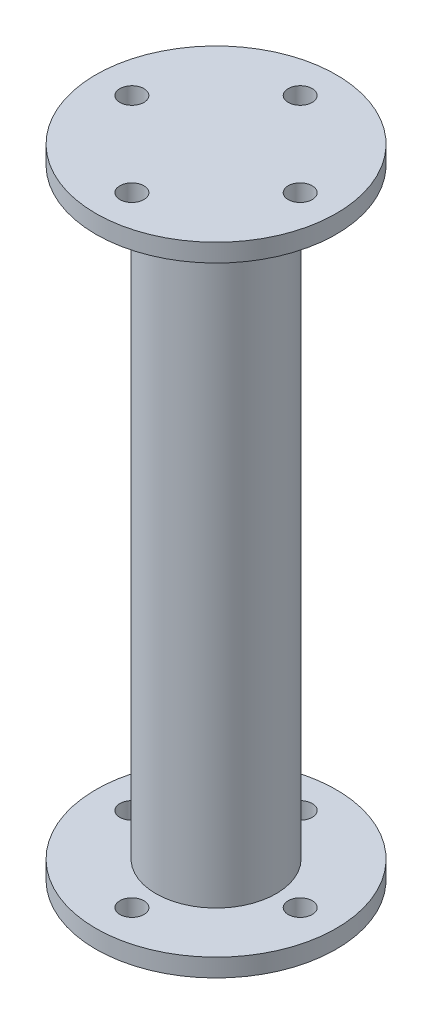
ISO-10303-21;
HEADER;
FILE_DESCRIPTION(('STEP AP214'),'2;1');
FILE_NAME('part.step','',(''),(''),'','','');
FILE_SCHEMA(('AUTOMOTIVE_DESIGN { 1 0 10303 214 1 1 1 1 }'));
ENDSEC;
DATA;
#1=APPLICATION_CONTEXT('core data for automotive mechanical design processes');
#2=APPLICATION_PROTOCOL_DEFINITION('international standard','automotive_design',2000,#1);
#3=PRODUCT_CONTEXT('',#1,'mechanical');
#4=PRODUCT('Part','Part','',(#3));
#5=PRODUCT_RELATED_PRODUCT_CATEGORY('part','',(#4));
#6=PRODUCT_DEFINITION_FORMATION('','',#4);
#7=PRODUCT_DEFINITION_CONTEXT('part definition',#1,'design');
#8=PRODUCT_DEFINITION('design','',#6,#7);
#9=PRODUCT_DEFINITION_SHAPE('','',#8);
#10=(LENGTH_UNIT() NAMED_UNIT(*) SI_UNIT(.MILLI.,.METRE.));
#11=(NAMED_UNIT(*) PLANE_ANGLE_UNIT() SI_UNIT($,.RADIAN.));
#12=(NAMED_UNIT(*) SI_UNIT($,.STERADIAN.) SOLID_ANGLE_UNIT());
#13=UNCERTAINTY_MEASURE_WITH_UNIT(LENGTH_MEASURE(1.E-05),#10,'distance_accuracy_value','');
#14=(GEOMETRIC_REPRESENTATION_CONTEXT(3) GLOBAL_UNCERTAINTY_ASSIGNED_CONTEXT((#13)) GLOBAL_UNIT_ASSIGNED_CONTEXT((#10,
#11,#12)) REPRESENTATION_CONTEXT('',''));
#15=CARTESIAN_POINT('',(0.,0.,0.));
#16=DIRECTION('',(0.,0.,1.));
#17=DIRECTION('',(1.,0.,0.));
#18=AXIS2_PLACEMENT_3D('',#15,#16,#17);
#19=CARTESIAN_POINT('',(-7.,1.5,0.));
#20=DIRECTION('',(0.,-1.,0.));
#21=DIRECTION('',(0.,0.,-1.));
#22=AXIS2_PLACEMENT_3D('',#19,#20,#21);
#23=CYLINDRICAL_SURFACE('',#22,1.);
#24=CARTESIAN_POINT('',(-7.,1.5,0.));
#25=DIRECTION('',(0.,1.,0.));
#26=DIRECTION('',(0.,0.,1.));
#27=AXIS2_PLACEMENT_3D('',#24,#25,#26);
#28=CIRCLE('',#27,1.);
#29=CARTESIAN_POINT('',(-7.,1.5,1.));
#30=VERTEX_POINT('',#29);
#31=EDGE_CURVE('E54',#30,#30,#28,.T.);
#32=ORIENTED_EDGE('',*,*,#31,.T.);
#33=EDGE_LOOP('',(#32));
#34=FACE_BOUND('',#33,.T.);
#35=CARTESIAN_POINT('',(-7.,0.,0.));
#36=DIRECTION('',(0.,1.,0.));
#37=DIRECTION('',(0.,0.,1.));
#38=AXIS2_PLACEMENT_3D('',#35,#36,#37);
#39=CIRCLE('',#38,1.);
#40=CARTESIAN_POINT('',(-7.,0.,1.));
#41=VERTEX_POINT('',#40);
#42=EDGE_CURVE('E86',#41,#41,#39,.T.);
#43=ORIENTED_EDGE('',*,*,#42,.F.);
#44=EDGE_LOOP('',(#43));
#45=FACE_BOUND('',#44,.T.);
#46=ADVANCED_FACE('F39',(#34,#45),#23,.F.);
#47=CARTESIAN_POINT('',(0.,1.5,-7.));
#48=DIRECTION('',(0.,-1.,0.));
#49=DIRECTION('',(0.,0.,-1.));
#50=AXIS2_PLACEMENT_3D('',#47,#48,#49);
#51=CYLINDRICAL_SURFACE('',#50,1.);
#52=CARTESIAN_POINT('',(0.,1.5,-7.));
#53=DIRECTION('',(0.,1.,0.));
#54=DIRECTION('',(0.,0.,1.));
#55=AXIS2_PLACEMENT_3D('',#52,#53,#54);
#56=CIRCLE('',#55,1.);
#57=CARTESIAN_POINT('',(0.,1.5,-6.));
#58=VERTEX_POINT('',#57);
#59=EDGE_CURVE('E68',#58,#58,#56,.T.);
#60=ORIENTED_EDGE('',*,*,#59,.T.);
#61=EDGE_LOOP('',(#60));
#62=FACE_BOUND('',#61,.T.);
#63=CARTESIAN_POINT('',(0.,0.,-7.));
#64=DIRECTION('',(0.,1.,0.));
#65=DIRECTION('',(0.,0.,1.));
#66=AXIS2_PLACEMENT_3D('',#63,#64,#65);
#67=CIRCLE('',#66,1.);
#68=CARTESIAN_POINT('',(0.,0.,-6.));
#69=VERTEX_POINT('',#68);
#70=EDGE_CURVE('E83',#69,#69,#67,.T.);
#71=ORIENTED_EDGE('',*,*,#70,.F.);
#72=EDGE_LOOP('',(#71));
#73=FACE_BOUND('',#72,.T.);
#74=ADVANCED_FACE('F115',(#62,#73),#51,.F.);
#75=CARTESIAN_POINT('',(7.,1.5,0.));
#76=DIRECTION('',(0.,-1.,0.));
#77=DIRECTION('',(0.,0.,-1.));
#78=AXIS2_PLACEMENT_3D('',#75,#76,#77);
#79=CYLINDRICAL_SURFACE('',#78,1.);
#80=CARTESIAN_POINT('',(7.,1.5,0.));
#81=DIRECTION('',(0.,1.,0.));
#82=DIRECTION('',(0.,0.,1.));
#83=AXIS2_PLACEMENT_3D('',#80,#81,#82);
#84=CIRCLE('',#83,1.);
#85=CARTESIAN_POINT('',(7.,1.5,1.));
#86=VERTEX_POINT('',#85);
#87=EDGE_CURVE('E64',#86,#86,#84,.T.);
#88=ORIENTED_EDGE('',*,*,#87,.T.);
#89=EDGE_LOOP('',(#88));
#90=FACE_BOUND('',#89,.T.);
#91=CARTESIAN_POINT('',(7.,0.,0.));
#92=DIRECTION('',(0.,1.,0.));
#93=DIRECTION('',(0.,0.,1.));
#94=AXIS2_PLACEMENT_3D('',#91,#92,#93);
#95=CIRCLE('',#94,1.);
#96=CARTESIAN_POINT('',(7.,0.,1.));
#97=VERTEX_POINT('',#96);
#98=EDGE_CURVE('E79',#97,#97,#95,.T.);
#99=ORIENTED_EDGE('',*,*,#98,.F.);
#100=EDGE_LOOP('',(#99));
#101=FACE_BOUND('',#100,.T.);
#102=ADVANCED_FACE('F121',(#90,#101),#79,.F.);
#103=CARTESIAN_POINT('',(0.,1.5,7.));
#104=DIRECTION('',(0.,-1.,0.));
#105=DIRECTION('',(0.,0.,-1.));
#106=AXIS2_PLACEMENT_3D('',#103,#104,#105);
#107=CYLINDRICAL_SURFACE('',#106,1.);
#108=CARTESIAN_POINT('',(0.,1.5,7.));
#109=DIRECTION('',(0.,1.,0.));
#110=DIRECTION('',(0.,0.,1.));
#111=AXIS2_PLACEMENT_3D('',#108,#109,#110);
#112=CIRCLE('',#111,1.);
#113=CARTESIAN_POINT('',(0.,1.5,8.));
#114=VERTEX_POINT('',#113);
#115=EDGE_CURVE('E60',#114,#114,#112,.T.);
#116=ORIENTED_EDGE('',*,*,#115,.T.);
#117=EDGE_LOOP('',(#116));
#118=FACE_BOUND('',#117,.T.);
#119=CARTESIAN_POINT('',(0.,0.,7.));
#120=DIRECTION('',(0.,1.,0.));
#121=DIRECTION('',(0.,0.,1.));
#122=AXIS2_PLACEMENT_3D('',#119,#120,#121);
#123=CIRCLE('',#122,1.);
#124=CARTESIAN_POINT('',(0.,0.,8.));
#125=VERTEX_POINT('',#124);
#126=EDGE_CURVE('E75',#125,#125,#123,.T.);
#127=ORIENTED_EDGE('',*,*,#126,.F.);
#128=EDGE_LOOP('',(#127));
#129=FACE_BOUND('',#128,.T.);
#130=ADVANCED_FACE('F41',(#118,#129),#107,.F.);
#131=CARTESIAN_POINT('',(0.,1.5,0.));
#132=DIRECTION('',(0.,-1.,0.));
#133=DIRECTION('',(0.,0.,-1.));
#134=AXIS2_PLACEMENT_3D('',#131,#132,#133);
#135=CYLINDRICAL_SURFACE('',#134,10.);
#136=CARTESIAN_POINT('',(0.,1.5,0.));
#137=DIRECTION('',(0.,1.,0.));
#138=DIRECTION('',(0.,0.,1.));
#139=AXIS2_PLACEMENT_3D('',#136,#137,#138);
#140=CIRCLE('',#139,10.);
#141=CARTESIAN_POINT('',(0.,1.5,10.));
#142=VERTEX_POINT('',#141);
#143=EDGE_CURVE('E48',#142,#142,#140,.T.);
#144=ORIENTED_EDGE('',*,*,#143,.F.);
#145=EDGE_LOOP('',(#144));
#146=FACE_BOUND('',#145,.T.);
#147=CARTESIAN_POINT('',(0.,0.,0.));
#148=DIRECTION('',(0.,1.,0.));
#149=DIRECTION('',(0.,0.,1.));
#150=AXIS2_PLACEMENT_3D('',#147,#148,#149);
#151=CIRCLE('',#150,10.);
#152=CARTESIAN_POINT('',(0.,0.,10.));
#153=VERTEX_POINT('',#152);
#154=EDGE_CURVE('E43',#153,#153,#151,.T.);
#155=ORIENTED_EDGE('',*,*,#154,.T.);
#156=EDGE_LOOP('',(#155));
#157=FACE_BOUND('',#156,.T.);
#158=ADVANCED_FACE('F95',(#146,#157),#135,.T.);
#159=CARTESIAN_POINT('',(0.,1.5,0.));
#160=DIRECTION('',(0.,1.,0.));
#161=DIRECTION('',(0.,0.,1.));
#162=AXIS2_PLACEMENT_3D('',#159,#160,#161);
#163=PLANE('',#162);
#164=CARTESIAN_POINT('',(0.,1.5,0.));
#165=DIRECTION('',(0.,1.,0.));
#166=DIRECTION('',(0.,0.,1.));
#167=AXIS2_PLACEMENT_3D('',#164,#165,#166);
#168=CIRCLE('',#167,5.);
#169=CARTESIAN_POINT('',(0.,1.5,5.));
#170=VERTEX_POINT('',#169);
#171=EDGE_CURVE('E10',#170,#170,#168,.T.);
#172=ORIENTED_EDGE('',*,*,#171,.F.);
#173=EDGE_LOOP('',(#172));
#174=FACE_BOUND('',#173,.T.);
#175=ORIENTED_EDGE('',*,*,#115,.F.);
#176=EDGE_LOOP('',(#175));
#177=FACE_BOUND('',#176,.T.);
#178=ORIENTED_EDGE('',*,*,#87,.F.);
#179=EDGE_LOOP('',(#178));
#180=FACE_BOUND('',#179,.T.);
#181=ORIENTED_EDGE('',*,*,#59,.F.);
#182=EDGE_LOOP('',(#181));
#183=FACE_BOUND('',#182,.T.);
#184=ORIENTED_EDGE('',*,*,#31,.F.);
#185=EDGE_LOOP('',(#184));
#186=FACE_BOUND('',#185,.T.);
#187=ORIENTED_EDGE('',*,*,#143,.T.);
#188=EDGE_LOOP('',(#187));
#189=FACE_BOUND('',#188,.T.);
#190=ADVANCED_FACE('F100',(#174,#177,#180,#183,#186,#189),#163,.T.);
#191=CARTESIAN_POINT('',(0.,0.,0.));
#192=DIRECTION('',(0.,1.,0.));
#193=DIRECTION('',(0.,0.,1.));
#194=AXIS2_PLACEMENT_3D('',#191,#192,#193);
#195=PLANE('',#194);
#196=ORIENTED_EDGE('',*,*,#126,.T.);
#197=EDGE_LOOP('',(#196));
#198=FACE_BOUND('',#197,.T.);
#199=ORIENTED_EDGE('',*,*,#98,.T.);
#200=EDGE_LOOP('',(#199));
#201=FACE_BOUND('',#200,.T.);
#202=ORIENTED_EDGE('',*,*,#70,.T.);
#203=EDGE_LOOP('',(#202));
#204=FACE_BOUND('',#203,.T.);
#205=ORIENTED_EDGE('',*,*,#42,.T.);
#206=EDGE_LOOP('',(#205));
#207=FACE_BOUND('',#206,.T.);
#208=ORIENTED_EDGE('',*,*,#154,.F.);
#209=EDGE_LOOP('',(#208));
#210=FACE_BOUND('',#209,.T.);
#211=ADVANCED_FACE('F97',(#198,#201,#204,#207,#210),#195,.F.);
#212=CARTESIAN_POINT('',(0.,51.5,0.));
#213=DIRECTION('',(0.,-1.,0.));
#214=DIRECTION('',(0.,0.,-1.));
#215=AXIS2_PLACEMENT_3D('',#212,#213,#214);
#216=CYLINDRICAL_SURFACE('',#215,5.);
#217=CARTESIAN_POINT('',(0.,51.5,0.));
#218=DIRECTION('',(0.,1.,0.));
#219=DIRECTION('',(0.,0.,1.));
#220=AXIS2_PLACEMENT_3D('',#217,#218,#219);
#221=CIRCLE('',#220,5.);
#222=CARTESIAN_POINT('',(0.,51.5,5.));
#223=VERTEX_POINT('',#222);
#224=EDGE_CURVE('E58',#223,#223,#221,.T.);
#225=ORIENTED_EDGE('',*,*,#224,.F.);
#226=EDGE_LOOP('',(#225));
#227=FACE_BOUND('',#226,.T.);
#228=ORIENTED_EDGE('',*,*,#171,.T.);
#229=EDGE_LOOP('',(#228));
#230=FACE_BOUND('',#229,.T.);
#231=ADVANCED_FACE('F99',(#227,#230),#216,.T.);
#232=CARTESIAN_POINT('',(-7.,51.5,0.));
#233=DIRECTION('',(0.,1.,0.));
#234=DIRECTION('',(0.,0.,1.));
#235=AXIS2_PLACEMENT_3D('',#232,#233,#234);
#236=CYLINDRICAL_SURFACE('',#235,1.);
#237=CARTESIAN_POINT('',(-7.,51.5,0.));
#238=DIRECTION('',(0.,1.,0.));
#239=DIRECTION('',(0.,0.,1.));
#240=AXIS2_PLACEMENT_3D('',#237,#238,#239);
#241=CIRCLE('',#240,1.);
#242=CARTESIAN_POINT('',(-7.,51.5,1.));
#243=VERTEX_POINT('',#242);
#244=EDGE_CURVE('E274',#243,#243,#241,.T.);
#245=ORIENTED_EDGE('',*,*,#244,.F.);
#246=EDGE_LOOP('',(#245));
#247=FACE_BOUND('',#246,.T.);
#248=CARTESIAN_POINT('',(-7.,53.,0.));
#249=DIRECTION('',(0.,1.,0.));
#250=DIRECTION('',(0.,0.,1.));
#251=AXIS2_PLACEMENT_3D('',#248,#249,#250);
#252=CIRCLE('',#251,1.);
#253=CARTESIAN_POINT('',(-7.,53.,1.));
#254=VERTEX_POINT('',#253);
#255=EDGE_CURVE('E250',#254,#254,#252,.T.);
#256=ORIENTED_EDGE('',*,*,#255,.T.);
#257=EDGE_LOOP('',(#256));
#258=FACE_BOUND('',#257,.T.);
#259=ADVANCED_FACE('F107',(#247,#258),#236,.F.);
#260=CARTESIAN_POINT('',(0.,51.5,-7.));
#261=DIRECTION('',(0.,1.,0.));
#262=DIRECTION('',(0.,0.,1.));
#263=AXIS2_PLACEMENT_3D('',#260,#261,#262);
#264=CYLINDRICAL_SURFACE('',#263,1.);
#265=CARTESIAN_POINT('',(0.,51.5,-7.));
#266=DIRECTION('',(0.,1.,0.));
#267=DIRECTION('',(0.,0.,1.));
#268=AXIS2_PLACEMENT_3D('',#265,#266,#267);
#269=CIRCLE('',#268,1.);
#270=CARTESIAN_POINT('',(0.,51.5,-6.));
#271=VERTEX_POINT('',#270);
#272=EDGE_CURVE('E278',#271,#271,#269,.T.);
#273=ORIENTED_EDGE('',*,*,#272,.F.);
#274=EDGE_LOOP('',(#273));
#275=FACE_BOUND('',#274,.T.);
#276=CARTESIAN_POINT('',(0.,53.,-7.));
#277=DIRECTION('',(0.,1.,0.));
#278=DIRECTION('',(0.,0.,1.));
#279=AXIS2_PLACEMENT_3D('',#276,#277,#278);
#280=CIRCLE('',#279,1.);
#281=CARTESIAN_POINT('',(0.,53.,-6.));
#282=VERTEX_POINT('',#281);
#283=EDGE_CURVE('E246',#282,#282,#280,.T.);
#284=ORIENTED_EDGE('',*,*,#283,.T.);
#285=EDGE_LOOP('',(#284));
#286=FACE_BOUND('',#285,.T.);
#287=ADVANCED_FACE('F171',(#275,#286),#264,.F.);
#288=CARTESIAN_POINT('',(7.,51.5,0.));
#289=DIRECTION('',(0.,1.,0.));
#290=DIRECTION('',(0.,0.,1.));
#291=AXIS2_PLACEMENT_3D('',#288,#289,#290);
#292=CYLINDRICAL_SURFACE('',#291,1.);
#293=CARTESIAN_POINT('',(7.,51.5,0.));
#294=DIRECTION('',(0.,1.,0.));
#295=DIRECTION('',(0.,0.,1.));
#296=AXIS2_PLACEMENT_3D('',#293,#294,#295);
#297=CIRCLE('',#296,1.);
#298=CARTESIAN_POINT('',(7.,51.5,1.));
#299=VERTEX_POINT('',#298);
#300=EDGE_CURVE('E260',#299,#299,#297,.T.);
#301=ORIENTED_EDGE('',*,*,#300,.F.);
#302=EDGE_LOOP('',(#301));
#303=FACE_BOUND('',#302,.T.);
#304=CARTESIAN_POINT('',(7.,53.,0.));
#305=DIRECTION('',(0.,1.,0.));
#306=DIRECTION('',(0.,0.,1.));
#307=AXIS2_PLACEMENT_3D('',#304,#305,#306);
#308=CIRCLE('',#307,1.);
#309=CARTESIAN_POINT('',(7.,53.,1.));
#310=VERTEX_POINT('',#309);
#311=EDGE_CURVE('E242',#310,#310,#308,.T.);
#312=ORIENTED_EDGE('',*,*,#311,.T.);
#313=EDGE_LOOP('',(#312));
#314=FACE_BOUND('',#313,.T.);
#315=ADVANCED_FACE('F181',(#303,#314),#292,.F.);
#316=CARTESIAN_POINT('',(0.,51.5,7.));
#317=DIRECTION('',(0.,1.,0.));
#318=DIRECTION('',(0.,0.,1.));
#319=AXIS2_PLACEMENT_3D('',#316,#317,#318);
#320=CYLINDRICAL_SURFACE('',#319,1.);
#321=CARTESIAN_POINT('',(0.,51.5,7.));
#322=DIRECTION('',(0.,1.,0.));
#323=DIRECTION('',(0.,0.,1.));
#324=AXIS2_PLACEMENT_3D('',#321,#322,#323);
#325=CIRCLE('',#324,1.);
#326=CARTESIAN_POINT('',(0.,51.5,8.));
#327=VERTEX_POINT('',#326);
#328=EDGE_CURVE('E256',#327,#327,#325,.T.);
#329=ORIENTED_EDGE('',*,*,#328,.F.);
#330=EDGE_LOOP('',(#329));
#331=FACE_BOUND('',#330,.T.);
#332=CARTESIAN_POINT('',(0.,53.,7.));
#333=DIRECTION('',(0.,1.,0.));
#334=DIRECTION('',(0.,0.,1.));
#335=AXIS2_PLACEMENT_3D('',#332,#333,#334);
#336=CIRCLE('',#335,1.);
#337=CARTESIAN_POINT('',(0.,53.,8.));
#338=VERTEX_POINT('',#337);
#339=EDGE_CURVE('E238',#338,#338,#336,.T.);
#340=ORIENTED_EDGE('',*,*,#339,.T.);
#341=EDGE_LOOP('',(#340));
#342=FACE_BOUND('',#341,.T.);
#343=ADVANCED_FACE('F191',(#331,#342),#320,.F.);
#344=CARTESIAN_POINT('',(0.,51.5,0.));
#345=DIRECTION('',(0.,1.,0.));
#346=DIRECTION('',(0.,0.,1.));
#347=AXIS2_PLACEMENT_3D('',#344,#345,#346);
#348=CYLINDRICAL_SURFACE('',#347,10.);
#349=CARTESIAN_POINT('',(0.,51.5,0.));
#350=DIRECTION('',(0.,1.,0.));
#351=DIRECTION('',(0.,0.,1.));
#352=AXIS2_PLACEMENT_3D('',#349,#350,#351);
#353=CIRCLE('',#352,10.);
#354=CARTESIAN_POINT('',(0.,51.5,10.));
#355=VERTEX_POINT('',#354);
#356=EDGE_CURVE('E270',#355,#355,#353,.T.);
#357=ORIENTED_EDGE('',*,*,#356,.T.);
#358=EDGE_LOOP('',(#357));
#359=FACE_BOUND('',#358,.T.);
#360=CARTESIAN_POINT('',(0.,53.,0.));
#361=DIRECTION('',(0.,1.,0.));
#362=DIRECTION('',(0.,0.,1.));
#363=AXIS2_PLACEMENT_3D('',#360,#361,#362);
#364=CIRCLE('',#363,10.);
#365=CARTESIAN_POINT('',(0.,53.,10.));
#366=VERTEX_POINT('',#365);
#367=EDGE_CURVE('E253',#366,#366,#364,.T.);
#368=ORIENTED_EDGE('',*,*,#367,.F.);
#369=EDGE_LOOP('',(#368));
#370=FACE_BOUND('',#369,.T.);
#371=ADVANCED_FACE('F201',(#359,#370),#348,.T.);
#372=CARTESIAN_POINT('',(0.,51.5,0.));
#373=DIRECTION('',(0.,-1.,0.));
#374=DIRECTION('',(0.,0.,1.));
#375=AXIS2_PLACEMENT_3D('',#372,#373,#374);
#376=PLANE('',#375);
#377=ORIENTED_EDGE('',*,*,#224,.T.);
#378=EDGE_LOOP('',(#377));
#379=FACE_BOUND('',#378,.T.);
#380=ORIENTED_EDGE('',*,*,#328,.T.);
#381=EDGE_LOOP('',(#380));
#382=FACE_BOUND('',#381,.T.);
#383=ORIENTED_EDGE('',*,*,#300,.T.);
#384=EDGE_LOOP('',(#383));
#385=FACE_BOUND('',#384,.T.);
#386=ORIENTED_EDGE('',*,*,#272,.T.);
#387=EDGE_LOOP('',(#386));
#388=FACE_BOUND('',#387,.T.);
#389=ORIENTED_EDGE('',*,*,#244,.T.);
#390=EDGE_LOOP('',(#389));
#391=FACE_BOUND('',#390,.T.);
#392=ORIENTED_EDGE('',*,*,#356,.F.);
#393=EDGE_LOOP('',(#392));
#394=FACE_BOUND('',#393,.T.);
#395=ADVANCED_FACE('F211',(#379,#382,#385,#388,#391,#394),#376,.T.);
#396=CARTESIAN_POINT('',(0.,53.,0.));
#397=DIRECTION('',(0.,-1.,0.));
#398=DIRECTION('',(0.,0.,1.));
#399=AXIS2_PLACEMENT_3D('',#396,#397,#398);
#400=PLANE('',#399);
#401=ORIENTED_EDGE('',*,*,#339,.F.);
#402=EDGE_LOOP('',(#401));
#403=FACE_BOUND('',#402,.T.);
#404=ORIENTED_EDGE('',*,*,#311,.F.);
#405=EDGE_LOOP('',(#404));
#406=FACE_BOUND('',#405,.T.);
#407=ORIENTED_EDGE('',*,*,#283,.F.);
#408=EDGE_LOOP('',(#407));
#409=FACE_BOUND('',#408,.T.);
#410=ORIENTED_EDGE('',*,*,#255,.F.);
#411=EDGE_LOOP('',(#410));
#412=FACE_BOUND('',#411,.T.);
#413=ORIENTED_EDGE('',*,*,#367,.T.);
#414=EDGE_LOOP('',(#413));
#415=FACE_BOUND('',#414,.T.);
#416=ADVANCED_FACE('F221',(#403,#406,#409,#412,#415),#400,.F.);
#417=CLOSED_SHELL('',(#46,#74,#102,#130,#158,#190,#211,#231,#259,#287,#315,#343,#371,#395,#416));
#418=MANIFOLD_SOLID_BREP('B2',#417);
#419=ADVANCED_BREP_SHAPE_REPRESENTATION('',(#18,#418),#14);
#420=SHAPE_DEFINITION_REPRESENTATION(#9,#419);
ENDSEC;
END-ISO-10303-21;
